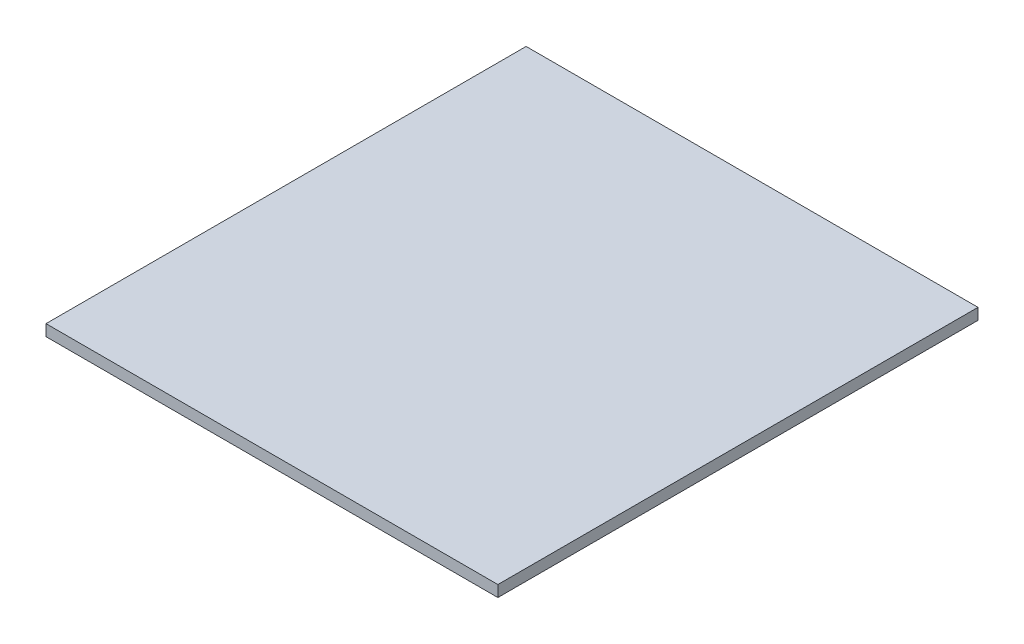
ISO-10303-21;
HEADER;
FILE_DESCRIPTION(('STEP AP214'),'2;1');
FILE_NAME('part.step','',(''),(''),'','','');
FILE_SCHEMA(('AUTOMOTIVE_DESIGN { 1 0 10303 214 1 1 1 1 }'));
ENDSEC;
DATA;
#1=APPLICATION_CONTEXT('core data for automotive mechanical design processes');
#2=APPLICATION_PROTOCOL_DEFINITION('international standard','automotive_design',2000,#1);
#3=PRODUCT_CONTEXT('',#1,'mechanical');
#4=PRODUCT('Part','Part','',(#3));
#5=PRODUCT_RELATED_PRODUCT_CATEGORY('part','',(#4));
#6=PRODUCT_DEFINITION_FORMATION('','',#4);
#7=PRODUCT_DEFINITION_CONTEXT('part definition',#1,'design');
#8=PRODUCT_DEFINITION('design','',#6,#7);
#9=PRODUCT_DEFINITION_SHAPE('','',#8);
#10=(LENGTH_UNIT() NAMED_UNIT(*) SI_UNIT(.MILLI.,.METRE.));
#11=(NAMED_UNIT(*) PLANE_ANGLE_UNIT() SI_UNIT($,.RADIAN.));
#12=(NAMED_UNIT(*) SI_UNIT($,.STERADIAN.) SOLID_ANGLE_UNIT());
#13=UNCERTAINTY_MEASURE_WITH_UNIT(LENGTH_MEASURE(1.E-05),#10,'distance_accuracy_value','');
#14=(GEOMETRIC_REPRESENTATION_CONTEXT(3) GLOBAL_UNCERTAINTY_ASSIGNED_CONTEXT((#13)) GLOBAL_UNIT_ASSIGNED_CONTEXT((#10,
#11,#12)) REPRESENTATION_CONTEXT('',''));
#15=CARTESIAN_POINT('',(0.,0.,0.));
#16=DIRECTION('',(0.,0.,1.));
#17=DIRECTION('',(1.,0.,0.));
#18=AXIS2_PLACEMENT_3D('',#15,#16,#17);
#19=CARTESIAN_POINT('',(-80.,4.,-117.361278986072));
#20=DIRECTION('',(1.,0.,0.));
#21=DIRECTION('',(0.,0.,-1.));
#22=AXIS2_PLACEMENT_3D('',#19,#20,#21);
#23=PLANE('',#22);
#24=DIRECTION('',(0.,0.,1.));
#25=VECTOR('',#24,1.);
#26=CARTESIAN_POINT('',(-80.,0.,-117.361278986072));
#27=LINE('',#26,#25);
#28=CARTESIAN_POINT('',(-80.,0.,-117.361278986072));
#29=VERTEX_POINT('',#28);
#30=CARTESIAN_POINT('',(-79.9999999999999,0.,52.6387210139284));
#31=VERTEX_POINT('',#30);
#32=EDGE_CURVE('E96',#29,#31,#27,.T.);
#33=ORIENTED_EDGE('',*,*,#32,.T.);
#34=DIRECTION('',(0.,-1.,0.));
#35=VECTOR('',#34,1.);
#36=CARTESIAN_POINT('',(-79.9999999999999,4.,52.6387210139284));
#37=LINE('',#36,#35);
#38=CARTESIAN_POINT('',(-79.9999999999999,4.,52.6387210139284));
#39=VERTEX_POINT('',#38);
#40=EDGE_CURVE('E11',#39,#31,#37,.T.);
#41=ORIENTED_EDGE('',*,*,#40,.F.);
#42=DIRECTION('',(0.,0.,1.));
#43=VECTOR('',#42,1.);
#44=CARTESIAN_POINT('',(-80.,4.,-117.361278986072));
#45=LINE('',#44,#43);
#46=CARTESIAN_POINT('',(-80.,4.,-117.361278986072));
#47=VERTEX_POINT('',#46);
#48=EDGE_CURVE('E82',#47,#39,#45,.T.);
#49=ORIENTED_EDGE('',*,*,#48,.F.);
#50=DIRECTION('',(0.,-1.,0.));
#51=VECTOR('',#50,1.);
#52=CARTESIAN_POINT('',(-80.,4.,-117.361278986072));
#53=LINE('',#52,#51);
#54=EDGE_CURVE('E49',#47,#29,#53,.T.);
#55=ORIENTED_EDGE('',*,*,#54,.T.);
#56=EDGE_LOOP('',(#33,#41,#49,#55));
#57=FACE_BOUND('',#56,.T.);
#58=ADVANCED_FACE('F33',(#57),#23,.F.);
#59=CARTESIAN_POINT('',(-79.9999999999999,4.,52.6387210139284));
#60=DIRECTION('',(0.,0.,-1.));
#61=DIRECTION('',(-1.,0.,0.));
#62=AXIS2_PLACEMENT_3D('',#59,#60,#61);
#63=PLANE('',#62);
#64=DIRECTION('',(1.,0.,0.));
#65=VECTOR('',#64,1.);
#66=CARTESIAN_POINT('',(-79.9999999999999,0.,52.6387210139284));
#67=LINE('',#66,#65);
#68=CARTESIAN_POINT('',(80.0000000000001,0.,52.6387210139284));
#69=VERTEX_POINT('',#68);
#70=EDGE_CURVE('E87',#31,#69,#67,.T.);
#71=ORIENTED_EDGE('',*,*,#70,.T.);
#72=DIRECTION('',(0.,-1.,0.));
#73=VECTOR('',#72,1.);
#74=CARTESIAN_POINT('',(80.0000000000001,4.,52.6387210139284));
#75=LINE('',#74,#73);
#76=CARTESIAN_POINT('',(80.0000000000001,4.,52.6387210139284));
#77=VERTEX_POINT('',#76);
#78=EDGE_CURVE('E41',#77,#69,#75,.T.);
#79=ORIENTED_EDGE('',*,*,#78,.F.);
#80=DIRECTION('',(1.,0.,0.));
#81=VECTOR('',#80,1.);
#82=CARTESIAN_POINT('',(-79.9999999999999,4.,52.6387210139284));
#83=LINE('',#82,#81);
#84=EDGE_CURVE('E74',#39,#77,#83,.T.);
#85=ORIENTED_EDGE('',*,*,#84,.F.);
#86=ORIENTED_EDGE('',*,*,#40,.T.);
#87=EDGE_LOOP('',(#71,#79,#85,#86));
#88=FACE_BOUND('',#87,.T.);
#89=ADVANCED_FACE('F86',(#88),#63,.F.);
#90=CARTESIAN_POINT('',(80.,4.,-117.361278986072));
#91=DIRECTION('',(1.,0.,0.));
#92=DIRECTION('',(0.,0.,-1.));
#93=AXIS2_PLACEMENT_3D('',#90,#91,#92);
#94=PLANE('',#93);
#95=DIRECTION('',(0.,0.,1.));
#96=VECTOR('',#95,1.);
#97=CARTESIAN_POINT('',(80.,0.,-117.361278986072));
#98=LINE('',#97,#96);
#99=CARTESIAN_POINT('',(80.,0.,-117.361278986072));
#100=VERTEX_POINT('',#99);
#101=EDGE_CURVE('E99',#100,#69,#98,.T.);
#102=ORIENTED_EDGE('',*,*,#101,.F.);
#103=DIRECTION('',(0.,-1.,0.));
#104=VECTOR('',#103,1.);
#105=CARTESIAN_POINT('',(80.,4.,-117.361278986072));
#106=LINE('',#105,#104);
#107=CARTESIAN_POINT('',(80.,4.,-117.361278986072));
#108=VERTEX_POINT('',#107);
#109=EDGE_CURVE('E63',#108,#100,#106,.T.);
#110=ORIENTED_EDGE('',*,*,#109,.F.);
#111=DIRECTION('',(0.,0.,1.));
#112=VECTOR('',#111,1.);
#113=CARTESIAN_POINT('',(80.,4.,-117.361278986072));
#114=LINE('',#113,#112);
#115=EDGE_CURVE('E81',#108,#77,#114,.T.);
#116=ORIENTED_EDGE('',*,*,#115,.T.);
#117=ORIENTED_EDGE('',*,*,#78,.T.);
#118=EDGE_LOOP('',(#102,#110,#116,#117));
#119=FACE_BOUND('',#118,.T.);
#120=ADVANCED_FACE('F90',(#119),#94,.T.);
#121=CARTESIAN_POINT('',(-80.,4.,-117.361278986072));
#122=DIRECTION('',(0.,0.,-1.));
#123=DIRECTION('',(-1.,0.,0.));
#124=AXIS2_PLACEMENT_3D('',#121,#122,#123);
#125=PLANE('',#124);
#126=DIRECTION('',(1.,0.,0.));
#127=VECTOR('',#126,1.);
#128=CARTESIAN_POINT('',(-80.,0.,-117.361278986072));
#129=LINE('',#128,#127);
#130=EDGE_CURVE('E101',#29,#100,#129,.T.);
#131=ORIENTED_EDGE('',*,*,#130,.F.);
#132=ORIENTED_EDGE('',*,*,#54,.F.);
#133=DIRECTION('',(1.,0.,0.));
#134=VECTOR('',#133,1.);
#135=CARTESIAN_POINT('',(-80.,4.,-117.361278986072));
#136=LINE('',#135,#134);
#137=EDGE_CURVE('E91',#47,#108,#136,.T.);
#138=ORIENTED_EDGE('',*,*,#137,.T.);
#139=ORIENTED_EDGE('',*,*,#109,.T.);
#140=EDGE_LOOP('',(#131,#132,#138,#139));
#141=FACE_BOUND('',#140,.T.);
#142=ADVANCED_FACE('F107',(#141),#125,.T.);
#143=CARTESIAN_POINT('',(0.,4.,0.));
#144=DIRECTION('',(0.,1.,0.));
#145=DIRECTION('',(0.,0.,1.));
#146=AXIS2_PLACEMENT_3D('',#143,#144,#145);
#147=PLANE('',#146);
#148=ORIENTED_EDGE('',*,*,#48,.T.);
#149=ORIENTED_EDGE('',*,*,#84,.T.);
#150=ORIENTED_EDGE('',*,*,#115,.F.);
#151=ORIENTED_EDGE('',*,*,#137,.F.);
#152=EDGE_LOOP('',(#148,#149,#150,#151));
#153=FACE_BOUND('',#152,.T.);
#154=ADVANCED_FACE('F78',(#153),#147,.T.);
#155=CARTESIAN_POINT('',(0.,0.,0.));
#156=DIRECTION('',(0.,1.,0.));
#157=DIRECTION('',(0.,0.,1.));
#158=AXIS2_PLACEMENT_3D('',#155,#156,#157);
#159=PLANE('',#158);
#160=ORIENTED_EDGE('',*,*,#32,.F.);
#161=ORIENTED_EDGE('',*,*,#130,.T.);
#162=ORIENTED_EDGE('',*,*,#101,.T.);
#163=ORIENTED_EDGE('',*,*,#70,.F.);
#164=EDGE_LOOP('',(#160,#161,#162,#163));
#165=FACE_BOUND('',#164,.T.);
#166=ADVANCED_FACE('F106',(#165),#159,.F.);
#167=CLOSED_SHELL('',(#58,#89,#120,#142,#154,#166));
#168=MANIFOLD_SOLID_BREP('B2',#167);
#169=ADVANCED_BREP_SHAPE_REPRESENTATION('',(#18,#168),#14);
#170=SHAPE_DEFINITION_REPRESENTATION(#9,#169);
ENDSEC;
END-ISO-10303-21;
